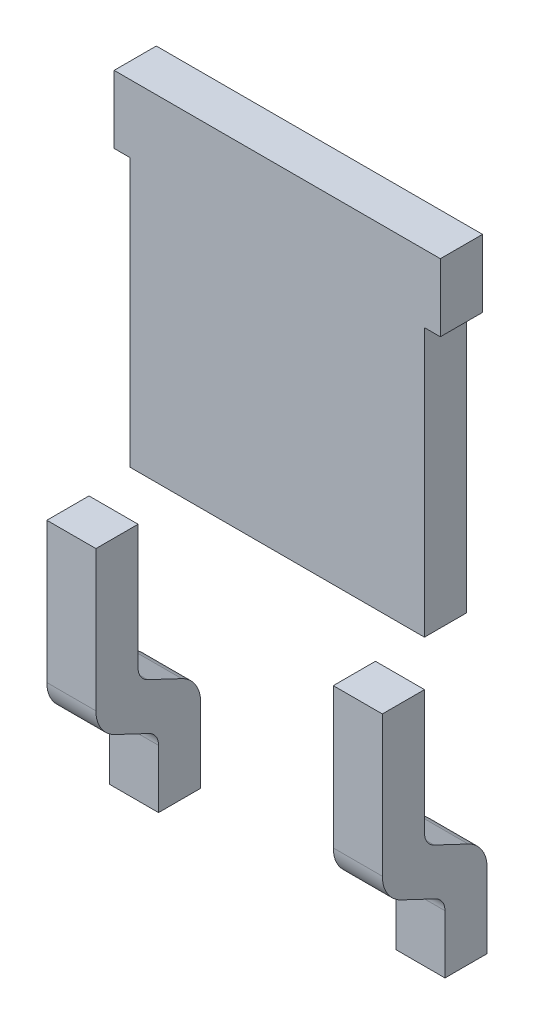
ISO-10303-21;
HEADER;
FILE_DESCRIPTION(('STEP AP214'),'2;1');
FILE_NAME('part.step','',(''),(''),'','','');
FILE_SCHEMA(('AUTOMOTIVE_DESIGN { 1 0 10303 214 1 1 1 1 }'));
ENDSEC;
DATA;
#1=APPLICATION_CONTEXT('core data for automotive mechanical design processes');
#2=APPLICATION_PROTOCOL_DEFINITION('international standard','automotive_design',2000,#1);
#3=PRODUCT_CONTEXT('',#1,'mechanical');
#4=PRODUCT('Part','Part','',(#3));
#5=PRODUCT_RELATED_PRODUCT_CATEGORY('part','',(#4));
#6=PRODUCT_DEFINITION_FORMATION('','',#4);
#7=PRODUCT_DEFINITION_CONTEXT('part definition',#1,'design');
#8=PRODUCT_DEFINITION('design','',#6,#7);
#9=PRODUCT_DEFINITION_SHAPE('','',#8);
#10=(LENGTH_UNIT() NAMED_UNIT(*) SI_UNIT(.MILLI.,.METRE.));
#11=(NAMED_UNIT(*) PLANE_ANGLE_UNIT() SI_UNIT($,.RADIAN.));
#12=(NAMED_UNIT(*) SI_UNIT($,.STERADIAN.) SOLID_ANGLE_UNIT());
#13=UNCERTAINTY_MEASURE_WITH_UNIT(LENGTH_MEASURE(1.E-05),#10,'distance_accuracy_value','');
#14=(GEOMETRIC_REPRESENTATION_CONTEXT(3) GLOBAL_UNCERTAINTY_ASSIGNED_CONTEXT((#13)) GLOBAL_UNIT_ASSIGNED_CONTEXT((#10,
#11,#12)) REPRESENTATION_CONTEXT('',''));
#15=CARTESIAN_POINT('',(0.,0.,0.));
#16=DIRECTION('',(0.,0.,1.));
#17=DIRECTION('',(1.,0.,0.));
#18=AXIS2_PLACEMENT_3D('',#15,#16,#17);
#19=CARTESIAN_POINT('',(0.,2.2733,0.));
#20=DIRECTION('',(0.,0.,1.));
#21=DIRECTION('',(1.,0.,0.));
#22=AXIS2_PLACEMENT_3D('',#19,#20,#21);
#23=PLANE('',#22);
#24=DIRECTION('',(1.,0.,0.));
#25=VECTOR('',#24,1.);
#26=CARTESIAN_POINT('',(0.,3.8735,0.));
#27=LINE('',#26,#25);
#28=CARTESIAN_POINT('',(-2.6035,3.8735,0.));
#29=VERTEX_POINT('',#28);
#30=CARTESIAN_POINT('',(-2.3495,3.8735,0.));
#31=VERTEX_POINT('',#30);
#32=EDGE_CURVE('P0_E87',#29,#31,#27,.T.);
#33=ORIENTED_EDGE('',*,*,#32,.F.);
#34=DIRECTION('',(0.,1.,0.));
#35=VECTOR('',#34,1.);
#36=CARTESIAN_POINT('',(-2.6035,2.2733,0.));
#37=LINE('',#36,#35);
#38=CARTESIAN_POINT('',(-2.6035,4.953,0.));
#39=VERTEX_POINT('',#38);
#40=EDGE_CURVE('P0_E20',#39,#29,#37,.F.);
#41=ORIENTED_EDGE('',*,*,#40,.F.);
#42=DIRECTION('',(1.,0.,0.));
#43=VECTOR('',#42,1.);
#44=CARTESIAN_POINT('',(2.6035,4.953,0.));
#45=LINE('',#44,#43);
#46=CARTESIAN_POINT('',(2.6035,4.953,0.));
#47=VERTEX_POINT('',#46);
#48=EDGE_CURVE('P0_E121',#47,#39,#45,.F.);
#49=ORIENTED_EDGE('',*,*,#48,.F.);
#50=DIRECTION('',(0.,1.,0.));
#51=VECTOR('',#50,1.);
#52=CARTESIAN_POINT('',(2.6035,3.8735,0.));
#53=LINE('',#52,#51);
#54=CARTESIAN_POINT('',(2.6035,3.8735,0.));
#55=VERTEX_POINT('',#54);
#56=EDGE_CURVE('P0_E115',#55,#47,#53,.T.);
#57=ORIENTED_EDGE('',*,*,#56,.F.);
#58=DIRECTION('',(1.,0.,0.));
#59=VECTOR('',#58,1.);
#60=CARTESIAN_POINT('',(2.3495,3.8735,0.));
#61=LINE('',#60,#59);
#62=CARTESIAN_POINT('',(2.3495,3.8735,0.));
#63=VERTEX_POINT('',#62);
#64=EDGE_CURVE('P0_E109',#63,#55,#61,.T.);
#65=ORIENTED_EDGE('',*,*,#64,.F.);
#66=DIRECTION('',(0.,1.,0.));
#67=VECTOR('',#66,1.);
#68=CARTESIAN_POINT('',(2.3495,-0.4064,0.));
#69=LINE('',#68,#67);
#70=CARTESIAN_POINT('',(2.3495,-0.4064,0.));
#71=VERTEX_POINT('',#70);
#72=EDGE_CURVE('P0_E103',#71,#63,#69,.T.);
#73=ORIENTED_EDGE('',*,*,#72,.F.);
#74=DIRECTION('',(1.,0.,0.));
#75=VECTOR('',#74,1.);
#76=CARTESIAN_POINT('',(-2.3495,-0.4064,0.));
#77=LINE('',#76,#75);
#78=CARTESIAN_POINT('',(-2.3495,-0.4064,0.));
#79=VERTEX_POINT('',#78);
#80=EDGE_CURVE('P0_E80',#79,#71,#77,.T.);
#81=ORIENTED_EDGE('',*,*,#80,.F.);
#82=DIRECTION('',(0.,1.,0.));
#83=VECTOR('',#82,1.);
#84=CARTESIAN_POINT('',(-2.3495,3.8735,0.));
#85=LINE('',#84,#83);
#86=EDGE_CURVE('P0_E95',#31,#79,#85,.F.);
#87=ORIENTED_EDGE('',*,*,#86,.F.);
#88=EDGE_LOOP('',(#33,#41,#49,#57,#65,#73,#81,#87));
#89=FACE_BOUND('',#88,.T.);
#90=ADVANCED_FACE('P0_F17',(#89),#23,.F.);
#91=CARTESIAN_POINT('',(-2.3495,3.8735,0.));
#92=DIRECTION('',(-1.,0.,0.));
#93=DIRECTION('',(0.,0.,1.));
#94=AXIS2_PLACEMENT_3D('',#91,#92,#93);
#95=PLANE('',#94);
#96=DIRECTION('',(0.,1.,0.));
#97=VECTOR('',#96,1.);
#98=CARTESIAN_POINT('',(-2.3495,2.2733,0.6731));
#99=LINE('',#98,#97);
#100=CARTESIAN_POINT('',(-2.3495,3.8735,0.6731));
#101=VERTEX_POINT('',#100);
#102=CARTESIAN_POINT('',(-2.3495,-0.4064,0.6731));
#103=VERTEX_POINT('',#102);
#104=EDGE_CURVE('P0_E92',#101,#103,#99,.F.);
#105=ORIENTED_EDGE('',*,*,#104,.F.);
#106=DIRECTION('',(0.,0.,1.));
#107=VECTOR('',#106,1.);
#108=CARTESIAN_POINT('',(-2.3495,3.8735,0.));
#109=LINE('',#108,#107);
#110=EDGE_CURVE('P0_E93',#31,#101,#109,.T.);
#111=ORIENTED_EDGE('',*,*,#110,.F.);
#112=ORIENTED_EDGE('',*,*,#86,.T.);
#113=DIRECTION('',(0.,0.,-1.));
#114=VECTOR('',#113,1.);
#115=CARTESIAN_POINT('',(-2.3495,-0.4064,0.));
#116=LINE('',#115,#114);
#117=EDGE_CURVE('P0_E100',#103,#79,#116,.T.);
#118=ORIENTED_EDGE('',*,*,#117,.F.);
#119=EDGE_LOOP('',(#105,#111,#112,#118));
#120=FACE_BOUND('',#119,.T.);
#121=ADVANCED_FACE('P0_F163',(#120),#95,.T.);
#122=CARTESIAN_POINT('',(-2.3495,-0.4064,0.));
#123=DIRECTION('',(0.,-1.,0.));
#124=DIRECTION('',(0.,0.,-1.));
#125=AXIS2_PLACEMENT_3D('',#122,#123,#124);
#126=PLANE('',#125);
#127=DIRECTION('',(1.,0.,0.));
#128=VECTOR('',#127,1.);
#129=CARTESIAN_POINT('',(0.,-0.4064,0.6731));
#130=LINE('',#129,#128);
#131=CARTESIAN_POINT('',(2.3495,-0.4064,0.6731));
#132=VERTEX_POINT('',#131);
#133=EDGE_CURVE('P0_E130',#103,#132,#130,.T.);
#134=ORIENTED_EDGE('',*,*,#133,.F.);
#135=ORIENTED_EDGE('',*,*,#117,.T.);
#136=ORIENTED_EDGE('',*,*,#80,.T.);
#137=DIRECTION('',(0.,0.,-1.));
#138=VECTOR('',#137,1.);
#139=CARTESIAN_POINT('',(2.3495,-0.4064,0.));
#140=LINE('',#139,#138);
#141=EDGE_CURVE('P0_E106',#132,#71,#140,.T.);
#142=ORIENTED_EDGE('',*,*,#141,.F.);
#143=EDGE_LOOP('',(#134,#135,#136,#142));
#144=FACE_BOUND('',#143,.T.);
#145=ADVANCED_FACE('P0_F161',(#144),#126,.T.);
#146=CARTESIAN_POINT('',(2.3495,-0.4064,0.));
#147=DIRECTION('',(1.,0.,0.));
#148=DIRECTION('',(0.,0.,-1.));
#149=AXIS2_PLACEMENT_3D('',#146,#147,#148);
#150=PLANE('',#149);
#151=DIRECTION('',(0.,1.,0.));
#152=VECTOR('',#151,1.);
#153=CARTESIAN_POINT('',(2.3495,2.2733,0.6731));
#154=LINE('',#153,#152);
#155=CARTESIAN_POINT('',(2.3495,3.8735,0.6731));
#156=VERTEX_POINT('',#155);
#157=EDGE_CURVE('P0_E133',#132,#156,#154,.T.);
#158=ORIENTED_EDGE('',*,*,#157,.F.);
#159=ORIENTED_EDGE('',*,*,#141,.T.);
#160=ORIENTED_EDGE('',*,*,#72,.T.);
#161=DIRECTION('',(0.,0.,1.));
#162=VECTOR('',#161,1.);
#163=CARTESIAN_POINT('',(2.3495,3.8735,0.));
#164=LINE('',#163,#162);
#165=EDGE_CURVE('P0_E112',#156,#63,#164,.F.);
#166=ORIENTED_EDGE('',*,*,#165,.F.);
#167=EDGE_LOOP('',(#158,#159,#160,#166));
#168=FACE_BOUND('',#167,.T.);
#169=ADVANCED_FACE('P0_F158',(#168),#150,.T.);
#170=CARTESIAN_POINT('',(2.3495,3.8735,0.));
#171=DIRECTION('',(0.,-1.,0.));
#172=DIRECTION('',(1.,0.,0.));
#173=AXIS2_PLACEMENT_3D('',#170,#171,#172);
#174=PLANE('',#173);
#175=DIRECTION('',(1.,0.,0.));
#176=VECTOR('',#175,1.);
#177=CARTESIAN_POINT('',(0.,3.8735,0.6731));
#178=LINE('',#177,#176);
#179=CARTESIAN_POINT('',(2.6035,3.8735,0.6731));
#180=VERTEX_POINT('',#179);
#181=EDGE_CURVE('P0_E136',#156,#180,#178,.T.);
#182=ORIENTED_EDGE('',*,*,#181,.F.);
#183=ORIENTED_EDGE('',*,*,#165,.T.);
#184=ORIENTED_EDGE('',*,*,#64,.T.);
#185=DIRECTION('',(0.,0.,-1.));
#186=VECTOR('',#185,1.);
#187=CARTESIAN_POINT('',(2.6035,3.8735,0.));
#188=LINE('',#187,#186);
#189=EDGE_CURVE('P0_E118',#180,#55,#188,.T.);
#190=ORIENTED_EDGE('',*,*,#189,.F.);
#191=EDGE_LOOP('',(#182,#183,#184,#190));
#192=FACE_BOUND('',#191,.T.);
#193=ADVANCED_FACE('P0_F155',(#192),#174,.T.);
#194=CARTESIAN_POINT('',(2.6035,3.8735,0.));
#195=DIRECTION('',(1.,0.,0.));
#196=DIRECTION('',(0.,0.,-1.));
#197=AXIS2_PLACEMENT_3D('',#194,#195,#196);
#198=PLANE('',#197);
#199=DIRECTION('',(0.,1.,0.));
#200=VECTOR('',#199,1.);
#201=CARTESIAN_POINT('',(2.6035,2.2733,0.6731));
#202=LINE('',#201,#200);
#203=CARTESIAN_POINT('',(2.6035,4.953,0.6731));
#204=VERTEX_POINT('',#203);
#205=EDGE_CURVE('P0_E139',#180,#204,#202,.T.);
#206=ORIENTED_EDGE('',*,*,#205,.F.);
#207=ORIENTED_EDGE('',*,*,#189,.T.);
#208=ORIENTED_EDGE('',*,*,#56,.T.);
#209=DIRECTION('',(0.,0.,1.));
#210=VECTOR('',#209,1.);
#211=CARTESIAN_POINT('',(2.6035,4.953,0.));
#212=LINE('',#211,#210);
#213=EDGE_CURVE('P0_E123',#204,#47,#212,.F.);
#214=ORIENTED_EDGE('',*,*,#213,.F.);
#215=EDGE_LOOP('',(#206,#207,#208,#214));
#216=FACE_BOUND('',#215,.T.);
#217=ADVANCED_FACE('P0_F152',(#216),#198,.T.);
#218=CARTESIAN_POINT('',(2.6035,4.953,0.));
#219=DIRECTION('',(0.,1.,0.));
#220=DIRECTION('',(0.,0.,1.));
#221=AXIS2_PLACEMENT_3D('',#218,#219,#220);
#222=PLANE('',#221);
#223=DIRECTION('',(1.,0.,0.));
#224=VECTOR('',#223,1.);
#225=CARTESIAN_POINT('',(0.,4.953,0.6731));
#226=LINE('',#225,#224);
#227=CARTESIAN_POINT('',(-2.6035,4.953,0.6731));
#228=VERTEX_POINT('',#227);
#229=EDGE_CURVE('P0_E142',#204,#228,#226,.F.);
#230=ORIENTED_EDGE('',*,*,#229,.F.);
#231=ORIENTED_EDGE('',*,*,#213,.T.);
#232=ORIENTED_EDGE('',*,*,#48,.T.);
#233=DIRECTION('',(0.,0.,1.));
#234=VECTOR('',#233,1.);
#235=CARTESIAN_POINT('',(-2.6035,4.953,0.));
#236=LINE('',#235,#234);
#237=EDGE_CURVE('P0_E84',#228,#39,#236,.F.);
#238=ORIENTED_EDGE('',*,*,#237,.F.);
#239=EDGE_LOOP('',(#230,#231,#232,#238));
#240=FACE_BOUND('',#239,.T.);
#241=ADVANCED_FACE('P0_F150',(#240),#222,.T.);
#242=CARTESIAN_POINT('',(-2.6035,4.953,0.));
#243=DIRECTION('',(-1.,0.,0.));
#244=DIRECTION('',(0.,0.,1.));
#245=AXIS2_PLACEMENT_3D('',#242,#243,#244);
#246=PLANE('',#245);
#247=DIRECTION('',(0.,1.,0.));
#248=VECTOR('',#247,1.);
#249=CARTESIAN_POINT('',(-2.6035,2.2733,0.6731));
#250=LINE('',#249,#248);
#251=CARTESIAN_POINT('',(-2.6035,3.8735,0.6731));
#252=VERTEX_POINT('',#251);
#253=EDGE_CURVE('P0_E26',#228,#252,#250,.F.);
#254=ORIENTED_EDGE('',*,*,#253,.F.);
#255=ORIENTED_EDGE('',*,*,#237,.T.);
#256=ORIENTED_EDGE('',*,*,#40,.T.);
#257=DIRECTION('',(0.,0.,1.));
#258=VECTOR('',#257,1.);
#259=CARTESIAN_POINT('',(-2.6035,3.8735,0.));
#260=LINE('',#259,#258);
#261=EDGE_CURVE('P0_E35',#252,#29,#260,.F.);
#262=ORIENTED_EDGE('',*,*,#261,.F.);
#263=EDGE_LOOP('',(#254,#255,#256,#262));
#264=FACE_BOUND('',#263,.T.);
#265=ADVANCED_FACE('P0_F83',(#264),#246,.T.);
#266=CARTESIAN_POINT('',(-2.6035,3.8735,0.));
#267=DIRECTION('',(0.,-1.,0.));
#268=DIRECTION('',(1.,0.,0.));
#269=AXIS2_PLACEMENT_3D('',#266,#267,#268);
#270=PLANE('',#269);
#271=DIRECTION('',(1.,0.,0.));
#272=VECTOR('',#271,1.);
#273=CARTESIAN_POINT('',(0.,3.8735,0.6731));
#274=LINE('',#273,#272);
#275=EDGE_CURVE('P0_E11',#252,#101,#274,.T.);
#276=ORIENTED_EDGE('',*,*,#275,.F.);
#277=ORIENTED_EDGE('',*,*,#261,.T.);
#278=ORIENTED_EDGE('',*,*,#32,.T.);
#279=ORIENTED_EDGE('',*,*,#110,.T.);
#280=EDGE_LOOP('',(#276,#277,#278,#279));
#281=FACE_BOUND('',#280,.T.);
#282=ADVANCED_FACE('P0_F89',(#281),#270,.T.);
#283=CARTESIAN_POINT('',(0.,2.2733,0.6731));
#284=DIRECTION('',(0.,0.,1.));
#285=DIRECTION('',(1.,0.,0.));
#286=AXIS2_PLACEMENT_3D('',#283,#284,#285);
#287=PLANE('',#286);
#288=ORIENTED_EDGE('',*,*,#253,.T.);
#289=ORIENTED_EDGE('',*,*,#275,.T.);
#290=ORIENTED_EDGE('',*,*,#104,.T.);
#291=ORIENTED_EDGE('',*,*,#133,.T.);
#292=ORIENTED_EDGE('',*,*,#157,.T.);
#293=ORIENTED_EDGE('',*,*,#181,.T.);
#294=ORIENTED_EDGE('',*,*,#205,.T.);
#295=ORIENTED_EDGE('',*,*,#229,.T.);
#296=EDGE_LOOP('',(#288,#289,#290,#291,#292,#293,#294,#295));
#297=FACE_BOUND('',#296,.T.);
#298=ADVANCED_FACE('P0_F146',(#297),#287,.T.);
#299=CLOSED_SHELL('',(#90,#121,#145,#169,#193,#217,#241,#265,#282,#298));
#300=MANIFOLD_SOLID_BREP('P0_B1',#299);
#301=CARTESIAN_POINT('',(2.6775,-2.8779687738,0.83655));
#302=DIRECTION('',(1.,0.,0.));
#303=DIRECTION('',(0.,0.,-1.));
#304=AXIS2_PLACEMENT_3D('',#301,#302,#303);
#305=PLANE('',#304);
#306=DIRECTION('',(0.,0.,-1.));
#307=VECTOR('',#306,1.);
#308=CARTESIAN_POINT('',(2.6775,-4.953,0.6731));
#309=LINE('',#308,#307);
#310=CARTESIAN_POINT('',(2.6775,-4.953,0.));
#311=VERTEX_POINT('',#310);
#312=CARTESIAN_POINT('',(2.6775,-4.953,0.6731));
#313=VERTEX_POINT('',#312);
#314=EDGE_CURVE('P1_E134',#311,#313,#309,.F.);
#315=ORIENTED_EDGE('',*,*,#314,.F.);
#316=DIRECTION('',(0.,1.,0.));
#317=VECTOR('',#316,1.);
#318=CARTESIAN_POINT('',(2.6775,-4.953,0.));
#319=LINE('',#318,#317);
#320=CARTESIAN_POINT('',(2.6775,-3.764557886399,0.));
#321=VERTEX_POINT('',#320);
#322=EDGE_CURVE('P1_E140',#321,#311,#319,.F.);
#323=ORIENTED_EDGE('',*,*,#322,.F.);
#324=CARTESIAN_POINT('',(2.6775,-3.764557886399,0.53));
#325=DIRECTION('',(1.,0.,0.));
#326=DIRECTION('',(0.,0.,-1.));
#327=AXIS2_PLACEMENT_3D('',#324,#325,#326);
#328=CIRCLE('',#327,0.53);
#329=CARTESIAN_POINT('',(2.6775,-3.28548074768504,0.303317192621508));
#330=VERTEX_POINT('',#329);
#331=EDGE_CURVE('P1_E92',#330,#321,#328,.F.);
#332=ORIENTED_EDGE('',*,*,#331,.F.);
#333=DIRECTION('',(0.,0.427703410149376,0.903919129649658));
#334=VECTOR('',#333,1.);
#335=CARTESIAN_POINT('',(2.6775,-3.285480747685,0.303317192622));
#336=LINE('',#335,#334);
#337=CARTESIAN_POINT('',(2.6775,-3.02759405623112,0.848341403689312));
#338=VERTEX_POINT('',#337);
#339=EDGE_CURVE('P1_E93',#330,#338,#336,.T.);
#340=ORIENTED_EDGE('',*,*,#339,.T.);
#341=CARTESIAN_POINT('',(2.6775,-2.788055486874,0.735));
#342=DIRECTION('',(1.,0.,0.));
#343=DIRECTION('',(0.,0.,-1.));
#344=AXIS2_PLACEMENT_3D('',#341,#342,#343);
#345=CIRCLE('',#344,0.265);
#346=CARTESIAN_POINT('',(2.6775,-2.788055486874,1.));
#347=VERTEX_POINT('',#346);
#348=EDGE_CURVE('P1_E20',#338,#347,#345,.F.);
#349=ORIENTED_EDGE('',*,*,#348,.T.);
#350=DIRECTION('',(0.,1.,0.));
#351=VECTOR('',#350,1.);
#352=CARTESIAN_POINT('',(2.6775,-2.955834430074,1.));
#353=LINE('',#352,#351);
#354=CARTESIAN_POINT('',(2.6775,-0.802937547601,1.));
#355=VERTEX_POINT('',#354);
#356=EDGE_CURVE('P1_E172',#355,#347,#353,.F.);
#357=ORIENTED_EDGE('',*,*,#356,.F.);
#358=DIRECTION('',(0.,0.,1.));
#359=VECTOR('',#358,1.);
#360=CARTESIAN_POINT('',(2.6775,-0.802937547601,1.));
#361=LINE('',#360,#359);
#362=CARTESIAN_POINT('',(2.6775,-0.802937547600993,1.6731));
#363=VERTEX_POINT('',#362);
#364=EDGE_CURVE('P1_E109',#363,#355,#361,.F.);
#365=ORIENTED_EDGE('',*,*,#364,.F.);
#366=DIRECTION('',(0.,-1.,0.));
#367=VECTOR('',#366,1.);
#368=CARTESIAN_POINT('',(2.6775,-0.802937547601,1.6731));
#369=LINE('',#368,#367);
#370=CARTESIAN_POINT('',(2.6775,-3.046435059402,1.6731));
#371=VERTEX_POINT('',#370);
#372=EDGE_CURVE('P1_E116',#371,#363,#369,.F.);
#373=ORIENTED_EDGE('',*,*,#372,.F.);
#374=CARTESIAN_POINT('',(2.6775,-3.046435059402,1.1431));
#375=DIRECTION('',(1.,0.,0.));
#376=DIRECTION('',(0.,0.,-1.));
#377=AXIS2_PLACEMENT_3D('',#374,#375,#376);
#378=CIRCLE('',#377,0.53);
#379=CARTESIAN_POINT('',(2.6775,-3.52551219811648,1.36978280737833));
#380=VERTEX_POINT('',#379);
#381=EDGE_CURVE('P1_E125',#380,#371,#378,.F.);
#382=ORIENTED_EDGE('',*,*,#381,.F.);
#383=DIRECTION('',(0.,-0.427703410148119,-0.903919129650252));
#384=VECTOR('',#383,1.);
#385=CARTESIAN_POINT('',(2.6775,-3.381992945801,1.6731));
#386=LINE('',#385,#384);
#387=CARTESIAN_POINT('',(2.6775,-3.78339888956958,0.824758596310751));
#388=VERTEX_POINT('',#387);
#389=EDGE_CURVE('P1_E122',#388,#380,#386,.F.);
#390=ORIENTED_EDGE('',*,*,#389,.F.);
#391=CARTESIAN_POINT('',(2.6775,-4.022937458927,0.9381));
#392=DIRECTION('',(1.,0.,0.));
#393=DIRECTION('',(0.,0.,-1.));
#394=AXIS2_PLACEMENT_3D('',#391,#392,#393);
#395=CIRCLE('',#394,0.265);
#396=CARTESIAN_POINT('',(2.6775,-4.022937458927,0.6731));
#397=VERTEX_POINT('',#396);
#398=EDGE_CURVE('P1_E130',#388,#397,#395,.F.);
#399=ORIENTED_EDGE('',*,*,#398,.T.);
#400=DIRECTION('',(0.,1.,0.));
#401=VECTOR('',#400,1.);
#402=CARTESIAN_POINT('',(2.6775,-3.855158515727,0.6731));
#403=LINE('',#402,#401);
#404=EDGE_CURVE('P1_E127',#313,#397,#403,.T.);
#405=ORIENTED_EDGE('',*,*,#404,.F.);
#406=EDGE_LOOP('',(#315,#323,#332,#340,#349,#357,#365,#373,#382,#390,#399,#405));
#407=FACE_BOUND('',#406,.T.);
#408=ADVANCED_FACE('P1_F17',(#407),#305,.T.);
#409=CARTESIAN_POINT('',(2.286,-3.764557886399,0.53));
#410=DIRECTION('',(1.,0.,0.));
#411=DIRECTION('',(0.,0.,-1.));
#412=AXIS2_PLACEMENT_3D('',#409,#410,#411);
#413=CYLINDRICAL_SURFACE('',#412,0.53);
#414=CARTESIAN_POINT('',(1.8945,-3.764557886399,0.53));
#415=DIRECTION('',(1.,0.,0.));
#416=DIRECTION('',(0.,0.,-1.));
#417=AXIS2_PLACEMENT_3D('',#414,#415,#416);
#418=CIRCLE('',#417,0.53);
#419=CARTESIAN_POINT('',(1.8945,-3.28548074768504,0.303317192621508));
#420=VERTEX_POINT('',#419);
#421=CARTESIAN_POINT('',(1.8945,-3.764557886399,0.));
#422=VERTEX_POINT('',#421);
#423=EDGE_CURVE('P1_E157',#420,#422,#418,.F.);
#424=ORIENTED_EDGE('',*,*,#423,.F.);
#425=DIRECTION('',(1.,0.,0.));
#426=VECTOR('',#425,1.);
#427=CARTESIAN_POINT('',(2.286,-3.28548074768468,0.303317192621849));
#428=LINE('',#427,#426);
#429=EDGE_CURVE('P1_E99',#330,#420,#428,.F.);
#430=ORIENTED_EDGE('',*,*,#429,.F.);
#431=ORIENTED_EDGE('',*,*,#331,.T.);
#432=DIRECTION('',(-1.,0.,0.));
#433=VECTOR('',#432,1.);
#434=CARTESIAN_POINT('',(2.286,-3.764557886399,0.));
#435=LINE('',#434,#433);
#436=EDGE_CURVE('P1_E143',#422,#321,#435,.F.);
#437=ORIENTED_EDGE('',*,*,#436,.F.);
#438=EDGE_LOOP('',(#424,#430,#431,#437));
#439=FACE_BOUND('',#438,.T.);
#440=ADVANCED_FACE('P1_F252',(#439),#413,.T.);
#441=CARTESIAN_POINT('',(2.286,-4.953,0.));
#442=DIRECTION('',(0.,0.,-1.));
#443=DIRECTION('',(-1.,0.,0.));
#444=AXIS2_PLACEMENT_3D('',#441,#442,#443);
#445=PLANE('',#444);
#446=DIRECTION('',(1.,0.,0.));
#447=VECTOR('',#446,1.);
#448=CARTESIAN_POINT('',(2.286,-4.953,0.));
#449=LINE('',#448,#447);
#450=CARTESIAN_POINT('',(1.8945,-4.953,0.));
#451=VERTEX_POINT('',#450);
#452=EDGE_CURVE('P1_E137',#451,#311,#449,.T.);
#453=ORIENTED_EDGE('',*,*,#452,.F.);
#454=DIRECTION('',(0.,1.,0.));
#455=VECTOR('',#454,1.);
#456=CARTESIAN_POINT('',(1.8945,-2.8779687738,0.));
#457=LINE('',#456,#455);
#458=EDGE_CURVE('P1_E160',#422,#451,#457,.F.);
#459=ORIENTED_EDGE('',*,*,#458,.F.);
#460=ORIENTED_EDGE('',*,*,#436,.T.);
#461=ORIENTED_EDGE('',*,*,#322,.T.);
#462=EDGE_LOOP('',(#453,#459,#460,#461));
#463=FACE_BOUND('',#462,.T.);
#464=ADVANCED_FACE('P1_F216',(#463),#445,.T.);
#465=CARTESIAN_POINT('',(2.286,-4.953,0.6731));
#466=DIRECTION('',(0.,-1.,0.));
#467=DIRECTION('',(0.,0.,-1.));
#468=AXIS2_PLACEMENT_3D('',#465,#466,#467);
#469=PLANE('',#468);
#470=DIRECTION('',(1.,0.,0.));
#471=VECTOR('',#470,1.);
#472=CARTESIAN_POINT('',(2.286,-4.953,0.6731));
#473=LINE('',#472,#471);
#474=CARTESIAN_POINT('',(1.8945,-4.953,0.6731));
#475=VERTEX_POINT('',#474);
#476=EDGE_CURVE('P1_E131',#475,#313,#473,.T.);
#477=ORIENTED_EDGE('',*,*,#476,.F.);
#478=DIRECTION('',(0.,0.,1.));
#479=VECTOR('',#478,1.);
#480=CARTESIAN_POINT('',(1.8945,-4.953,0.83655));
#481=LINE('',#480,#479);
#482=EDGE_CURVE('P1_E204',#451,#475,#481,.T.);
#483=ORIENTED_EDGE('',*,*,#482,.F.);
#484=ORIENTED_EDGE('',*,*,#452,.T.);
#485=ORIENTED_EDGE('',*,*,#314,.T.);
#486=EDGE_LOOP('',(#477,#483,#484,#485));
#487=FACE_BOUND('',#486,.T.);
#488=ADVANCED_FACE('P1_F213',(#487),#469,.T.);
#489=CARTESIAN_POINT('',(2.286,-3.855158515727,0.6731));
#490=DIRECTION('',(0.,0.,1.));
#491=DIRECTION('',(1.,0.,0.));
#492=AXIS2_PLACEMENT_3D('',#489,#490,#491);
#493=PLANE('',#492);
#494=ORIENTED_EDGE('',*,*,#476,.T.);
#495=ORIENTED_EDGE('',*,*,#404,.T.);
#496=DIRECTION('',(1.,0.,0.));
#497=VECTOR('',#496,1.);
#498=CARTESIAN_POINT('',(2.286,-4.022937458927,0.6731));
#499=LINE('',#498,#497);
#500=CARTESIAN_POINT('',(1.8945,-4.022937458927,0.6731));
#501=VERTEX_POINT('',#500);
#502=EDGE_CURVE('P1_E163',#397,#501,#499,.F.);
#503=ORIENTED_EDGE('',*,*,#502,.T.);
#504=DIRECTION('',(0.,1.,0.));
#505=VECTOR('',#504,1.);
#506=CARTESIAN_POINT('',(1.8945,-2.8779687738,0.6731));
#507=LINE('',#506,#505);
#508=EDGE_CURVE('P1_E156',#475,#501,#507,.T.);
#509=ORIENTED_EDGE('',*,*,#508,.F.);
#510=EDGE_LOOP('',(#494,#495,#503,#509));
#511=FACE_BOUND('',#510,.T.);
#512=ADVANCED_FACE('P1_F287',(#511),#493,.T.);
#513=CARTESIAN_POINT('',(2.286,-4.022937458927,0.9381));
#514=DIRECTION('',(1.,0.,0.));
#515=DIRECTION('',(0.,0.,-1.));
#516=AXIS2_PLACEMENT_3D('',#513,#514,#515);
#517=CYLINDRICAL_SURFACE('',#516,0.265);
#518=ORIENTED_EDGE('',*,*,#502,.F.);
#519=ORIENTED_EDGE('',*,*,#398,.F.);
#520=DIRECTION('',(1.,0.,0.));
#521=VECTOR('',#520,1.);
#522=CARTESIAN_POINT('',(2.286,-3.78339888956956,0.824758596310793));
#523=LINE('',#522,#521);
#524=CARTESIAN_POINT('',(1.8945,-3.78339888956988,0.824758596310688));
#525=VERTEX_POINT('',#524);
#526=EDGE_CURVE('P1_E126',#525,#388,#523,.T.);
#527=ORIENTED_EDGE('',*,*,#526,.F.);
#528=CARTESIAN_POINT('',(1.8945,-4.022937458927,0.9381));
#529=DIRECTION('',(1.,0.,0.));
#530=DIRECTION('',(0.,0.,-1.));
#531=AXIS2_PLACEMENT_3D('',#528,#529,#530);
#532=CIRCLE('',#531,0.265);
#533=EDGE_CURVE('P1_E153',#501,#525,#532,.T.);
#534=ORIENTED_EDGE('',*,*,#533,.F.);
#535=EDGE_LOOP('',(#518,#519,#527,#534));
#536=FACE_BOUND('',#535,.T.);
#537=ADVANCED_FACE('P1_F283',(#536),#517,.F.);
#538=CARTESIAN_POINT('',(2.286,-3.381992945801,1.6731));
#539=DIRECTION('',(0.,-0.903919129650252,0.427703410148119));
#540=DIRECTION('',(0.,-0.427703410148119,-0.903919129650252));
#541=AXIS2_PLACEMENT_3D('',#538,#539,#540);
#542=PLANE('',#541);
#543=DIRECTION('',(1.,0.,0.));
#544=VECTOR('',#543,1.);
#545=CARTESIAN_POINT('',(2.286,-3.52551219811671,1.36978280737834));
#546=LINE('',#545,#544);
#547=CARTESIAN_POINT('',(1.8945,-3.52551219811616,1.36978280737858));
#548=VERTEX_POINT('',#547);
#549=EDGE_CURVE('P1_E162',#548,#380,#546,.T.);
#550=ORIENTED_EDGE('',*,*,#549,.F.);
#551=DIRECTION('',(0.,0.427703410149377,0.903919129649657));
#552=VECTOR('',#551,1.);
#553=CARTESIAN_POINT('',(1.8945,-3.78339888957,0.824758596311));
#554=LINE('',#553,#552);
#555=EDGE_CURVE('P1_E152',#525,#548,#554,.T.);
#556=ORIENTED_EDGE('',*,*,#555,.F.);
#557=ORIENTED_EDGE('',*,*,#526,.T.);
#558=ORIENTED_EDGE('',*,*,#389,.T.);
#559=EDGE_LOOP('',(#550,#556,#557,#558));
#560=FACE_BOUND('',#559,.T.);
#561=ADVANCED_FACE('P1_F279',(#560),#542,.T.);
#562=CARTESIAN_POINT('',(2.286,-3.046435059402,1.1431));
#563=DIRECTION('',(1.,0.,0.));
#564=DIRECTION('',(0.,0.,-1.));
#565=AXIS2_PLACEMENT_3D('',#562,#563,#564);
#566=CYLINDRICAL_SURFACE('',#565,0.53);
#567=CARTESIAN_POINT('',(1.8945,-3.046435059402,1.1431));
#568=DIRECTION('',(1.,0.,0.));
#569=DIRECTION('',(0.,0.,-1.));
#570=AXIS2_PLACEMENT_3D('',#567,#568,#569);
#571=CIRCLE('',#570,0.53);
#572=CARTESIAN_POINT('',(1.8945,-3.046435059402,1.6731));
#573=VERTEX_POINT('',#572);
#574=EDGE_CURVE('P1_E148',#548,#573,#571,.F.);
#575=ORIENTED_EDGE('',*,*,#574,.F.);
#576=ORIENTED_EDGE('',*,*,#549,.T.);
#577=ORIENTED_EDGE('',*,*,#381,.T.);
#578=DIRECTION('',(1.,0.,0.));
#579=VECTOR('',#578,1.);
#580=CARTESIAN_POINT('',(2.286,-3.046435059402,1.6731));
#581=LINE('',#580,#579);
#582=EDGE_CURVE('P1_E119',#573,#371,#581,.T.);
#583=ORIENTED_EDGE('',*,*,#582,.F.);
#584=EDGE_LOOP('',(#575,#576,#577,#583));
#585=FACE_BOUND('',#584,.T.);
#586=ADVANCED_FACE('P1_F276',(#585),#566,.T.);
#587=CARTESIAN_POINT('',(2.286,-0.802937547601,1.6731));
#588=DIRECTION('',(0.,0.,1.));
#589=DIRECTION('',(0.,-1.,0.));
#590=AXIS2_PLACEMENT_3D('',#587,#588,#589);
#591=PLANE('',#590);
#592=DIRECTION('',(1.,0.,0.));
#593=VECTOR('',#592,1.);
#594=CARTESIAN_POINT('',(2.286,-0.802937547600989,1.6731));
#595=LINE('',#594,#593);
#596=CARTESIAN_POINT('',(1.8945,-0.802937547600996,1.6731));
#597=VERTEX_POINT('',#596);
#598=EDGE_CURVE('P1_E113',#597,#363,#595,.T.);
#599=ORIENTED_EDGE('',*,*,#598,.F.);
#600=DIRECTION('',(0.,1.,0.));
#601=VECTOR('',#600,1.);
#602=CARTESIAN_POINT('',(1.8945,-2.8779687738,1.6731));
#603=LINE('',#602,#601);
#604=EDGE_CURVE('P1_E151',#573,#597,#603,.T.);
#605=ORIENTED_EDGE('',*,*,#604,.F.);
#606=ORIENTED_EDGE('',*,*,#582,.T.);
#607=ORIENTED_EDGE('',*,*,#372,.T.);
#608=EDGE_LOOP('',(#599,#605,#606,#607));
#609=FACE_BOUND('',#608,.T.);
#610=ADVANCED_FACE('P1_F273',(#609),#591,.T.);
#611=CARTESIAN_POINT('',(2.286,-0.802937547601,1.));
#612=DIRECTION('',(0.,1.,0.));
#613=DIRECTION('',(0.,0.,1.));
#614=AXIS2_PLACEMENT_3D('',#611,#612,#613);
#615=PLANE('',#614);
#616=DIRECTION('',(-1.,0.,0.));
#617=VECTOR('',#616,1.);
#618=CARTESIAN_POINT('',(2.286,-0.802937547601,1.));
#619=LINE('',#618,#617);
#620=CARTESIAN_POINT('',(1.8945,-0.802937547601,1.));
#621=VERTEX_POINT('',#620);
#622=EDGE_CURVE('P1_E112',#621,#355,#619,.F.);
#623=ORIENTED_EDGE('',*,*,#622,.F.);
#624=DIRECTION('',(0.,0.,1.));
#625=VECTOR('',#624,1.);
#626=CARTESIAN_POINT('',(1.8945,-0.802937547601,0.83655));
#627=LINE('',#626,#625);
#628=EDGE_CURVE('P1_E184',#597,#621,#627,.F.);
#629=ORIENTED_EDGE('',*,*,#628,.F.);
#630=ORIENTED_EDGE('',*,*,#598,.T.);
#631=ORIENTED_EDGE('',*,*,#364,.T.);
#632=EDGE_LOOP('',(#623,#629,#630,#631));
#633=FACE_BOUND('',#632,.T.);
#634=ADVANCED_FACE('P1_F227',(#633),#615,.T.);
#635=CARTESIAN_POINT('',(2.286,-2.955834430074,1.));
#636=DIRECTION('',(0.,0.,-1.));
#637=DIRECTION('',(-1.,0.,0.));
#638=AXIS2_PLACEMENT_3D('',#635,#636,#637);
#639=PLANE('',#638);
#640=ORIENTED_EDGE('',*,*,#622,.T.);
#641=ORIENTED_EDGE('',*,*,#356,.T.);
#642=DIRECTION('',(1.,0.,0.));
#643=VECTOR('',#642,1.);
#644=CARTESIAN_POINT('',(2.286,-2.788055486874,1.));
#645=LINE('',#644,#643);
#646=CARTESIAN_POINT('',(1.8945,-2.788055486874,1.));
#647=VERTEX_POINT('',#646);
#648=EDGE_CURVE('P1_E87',#347,#647,#645,.F.);
#649=ORIENTED_EDGE('',*,*,#648,.T.);
#650=DIRECTION('',(0.,1.,0.));
#651=VECTOR('',#650,1.);
#652=CARTESIAN_POINT('',(1.8945,-2.8779687738,1.));
#653=LINE('',#652,#651);
#654=EDGE_CURVE('P1_E147',#621,#647,#653,.F.);
#655=ORIENTED_EDGE('',*,*,#654,.F.);
#656=EDGE_LOOP('',(#640,#641,#649,#655));
#657=FACE_BOUND('',#656,.T.);
#658=ADVANCED_FACE('P1_F231',(#657),#639,.T.);
#659=CARTESIAN_POINT('',(2.286,-2.788055486874,0.735));
#660=DIRECTION('',(1.,0.,0.));
#661=DIRECTION('',(0.,0.,-1.));
#662=AXIS2_PLACEMENT_3D('',#659,#660,#661);
#663=CYLINDRICAL_SURFACE('',#662,0.265);
#664=ORIENTED_EDGE('',*,*,#648,.F.);
#665=ORIENTED_EDGE('',*,*,#348,.F.);
#666=DIRECTION('',(1.,0.,0.));
#667=VECTOR('',#666,1.);
#668=CARTESIAN_POINT('',(2.286,-3.02759405623144,0.848341403689207));
#669=LINE('',#668,#667);
#670=CARTESIAN_POINT('',(1.8945,-3.02759405623112,0.848341403689312));
#671=VERTEX_POINT('',#670);
#672=EDGE_CURVE('P1_E35',#671,#338,#669,.T.);
#673=ORIENTED_EDGE('',*,*,#672,.F.);
#674=CARTESIAN_POINT('',(1.8945,-2.788055486874,0.735));
#675=DIRECTION('',(1.,0.,0.));
#676=DIRECTION('',(0.,0.,-1.));
#677=AXIS2_PLACEMENT_3D('',#674,#675,#676);
#678=CIRCLE('',#677,0.265);
#679=EDGE_CURVE('P1_E26',#647,#671,#678,.T.);
#680=ORIENTED_EDGE('',*,*,#679,.F.);
#681=EDGE_LOOP('',(#664,#665,#673,#680));
#682=FACE_BOUND('',#681,.T.);
#683=ADVANCED_FACE('P1_F86',(#682),#663,.F.);
#684=CARTESIAN_POINT('',(2.286,-3.429,0.));
#685=DIRECTION('',(0.,0.903919129650252,-0.427703410148119));
#686=DIRECTION('',(0.,0.427703410148119,0.903919129650252));
#687=AXIS2_PLACEMENT_3D('',#684,#685,#686);
#688=PLANE('',#687);
#689=ORIENTED_EDGE('',*,*,#429,.T.);
#690=DIRECTION('',(0.,-0.427703410149376,-0.903919129649658));
#691=VECTOR('',#690,1.);
#692=CARTESIAN_POINT('',(1.8945,-3.027594056231,0.848341403689));
#693=LINE('',#692,#691);
#694=EDGE_CURVE('P1_E11',#671,#420,#693,.T.);
#695=ORIENTED_EDGE('',*,*,#694,.F.);
#696=ORIENTED_EDGE('',*,*,#672,.T.);
#697=ORIENTED_EDGE('',*,*,#339,.F.);
#698=EDGE_LOOP('',(#689,#695,#696,#697));
#699=FACE_BOUND('',#698,.T.);
#700=ADVANCED_FACE('P1_F96',(#699),#688,.T.);
#701=CARTESIAN_POINT('',(1.8945,-2.8779687738,0.83655));
#702=DIRECTION('',(-1.,0.,0.));
#703=DIRECTION('',(0.,0.,1.));
#704=AXIS2_PLACEMENT_3D('',#701,#702,#703);
#705=PLANE('',#704);
#706=ORIENTED_EDGE('',*,*,#679,.T.);
#707=ORIENTED_EDGE('',*,*,#694,.T.);
#708=ORIENTED_EDGE('',*,*,#423,.T.);
#709=ORIENTED_EDGE('',*,*,#458,.T.);
#710=ORIENTED_EDGE('',*,*,#482,.T.);
#711=ORIENTED_EDGE('',*,*,#508,.T.);
#712=ORIENTED_EDGE('',*,*,#533,.T.);
#713=ORIENTED_EDGE('',*,*,#555,.T.);
#714=ORIENTED_EDGE('',*,*,#574,.T.);
#715=ORIENTED_EDGE('',*,*,#604,.T.);
#716=ORIENTED_EDGE('',*,*,#628,.T.);
#717=ORIENTED_EDGE('',*,*,#654,.T.);
#718=EDGE_LOOP('',(#706,#707,#708,#709,#710,#711,#712,#713,#714,#715,#716,#717));
#719=FACE_BOUND('',#718,.T.);
#720=ADVANCED_FACE('P1_F234',(#719),#705,.T.);
#721=CLOSED_SHELL('',(#408,#440,#464,#488,#512,#537,#561,#586,#610,#634,#658,#683,#700,#720));
#722=MANIFOLD_SOLID_BREP('P1_B1',#721);
#723=CARTESIAN_POINT('',(-2.6775,-2.8779687738,0.83655));
#724=DIRECTION('',(1.,0.,0.));
#725=DIRECTION('',(0.,0.,-1.));
#726=AXIS2_PLACEMENT_3D('',#723,#724,#725);
#727=PLANE('',#726);
#728=DIRECTION('',(0.,1.,0.));
#729=VECTOR('',#728,1.);
#730=CARTESIAN_POINT('',(-2.6775,-4.953,0.));
#731=LINE('',#730,#729);
#732=CARTESIAN_POINT('',(-2.6775,-3.764557886399,0.));
#733=VERTEX_POINT('',#732);
#734=CARTESIAN_POINT('',(-2.6775,-4.953,0.));
#735=VERTEX_POINT('',#734);
#736=EDGE_CURVE('P2_E181',#733,#735,#731,.F.);
#737=ORIENTED_EDGE('',*,*,#736,.T.);
#738=DIRECTION('',(0.,0.,1.));
#739=VECTOR('',#738,1.);
#740=CARTESIAN_POINT('',(-2.6775,-4.953,0.6731));
#741=LINE('',#740,#739);
#742=CARTESIAN_POINT('',(-2.6775,-4.953,0.6731));
#743=VERTEX_POINT('',#742);
#744=EDGE_CURVE('P2_E94',#735,#743,#741,.T.);
#745=ORIENTED_EDGE('',*,*,#744,.T.);
#746=DIRECTION('',(0.,1.,0.));
#747=VECTOR('',#746,1.);
#748=CARTESIAN_POINT('',(-2.6775,-3.855158515727,0.6731));
#749=LINE('',#748,#747);
#750=CARTESIAN_POINT('',(-2.6775,-4.022937458927,0.6731));
#751=VERTEX_POINT('',#750);
#752=EDGE_CURVE('P2_E164',#743,#751,#749,.T.);
#753=ORIENTED_EDGE('',*,*,#752,.T.);
#754=CARTESIAN_POINT('',(-2.6775,-4.022937458927,0.9381));
#755=DIRECTION('',(1.,0.,0.));
#756=DIRECTION('',(0.,0.,-1.));
#757=AXIS2_PLACEMENT_3D('',#754,#755,#756);
#758=CIRCLE('',#757,0.265);
#759=CARTESIAN_POINT('',(-2.6775,-3.78339888956958,0.824758596310751));
#760=VERTEX_POINT('',#759);
#761=EDGE_CURVE('P2_E163',#751,#760,#758,.T.);
#762=ORIENTED_EDGE('',*,*,#761,.T.);
#763=DIRECTION('',(0.,0.427703410148119,0.903919129650252));
#764=VECTOR('',#763,1.);
#765=CARTESIAN_POINT('',(-2.6775,-3.381992945801,1.6731));
#766=LINE('',#765,#764);
#767=CARTESIAN_POINT('',(-2.6775,-3.52551219811648,1.36978280737833));
#768=VERTEX_POINT('',#767);
#769=EDGE_CURVE('P2_E159',#760,#768,#766,.T.);
#770=ORIENTED_EDGE('',*,*,#769,.T.);
#771=CARTESIAN_POINT('',(-2.6775,-3.046435059402,1.1431));
#772=DIRECTION('',(1.,0.,0.));
#773=DIRECTION('',(0.,0.,-1.));
#774=AXIS2_PLACEMENT_3D('',#771,#772,#773);
#775=CIRCLE('',#774,0.53);
#776=CARTESIAN_POINT('',(-2.6775,-3.046435059402,1.6731));
#777=VERTEX_POINT('',#776);
#778=EDGE_CURVE('P2_E155',#777,#768,#775,.T.);
#779=ORIENTED_EDGE('',*,*,#778,.F.);
#780=DIRECTION('',(0.,1.,0.));
#781=VECTOR('',#780,1.);
#782=CARTESIAN_POINT('',(-2.6775,-0.802937547601,1.6731));
#783=LINE('',#782,#781);
#784=CARTESIAN_POINT('',(-2.6775,-0.802937547600989,1.6731));
#785=VERTEX_POINT('',#784);
#786=EDGE_CURVE('P2_E152',#777,#785,#783,.T.);
#787=ORIENTED_EDGE('',*,*,#786,.T.);
#788=DIRECTION('',(0.,0.,-1.));
#789=VECTOR('',#788,1.);
#790=CARTESIAN_POINT('',(-2.6775,-0.802937547601,1.));
#791=LINE('',#790,#789);
#792=CARTESIAN_POINT('',(-2.6775,-0.802937547601,1.));
#793=VERTEX_POINT('',#792);
#794=EDGE_CURVE('P2_E146',#785,#793,#791,.T.);
#795=ORIENTED_EDGE('',*,*,#794,.T.);
#796=DIRECTION('',(0.,1.,0.));
#797=VECTOR('',#796,1.);
#798=CARTESIAN_POINT('',(-2.6775,-2.955834430074,1.));
#799=LINE('',#798,#797);
#800=CARTESIAN_POINT('',(-2.6775,-2.788055486874,1.));
#801=VERTEX_POINT('',#800);
#802=EDGE_CURVE('P2_E118',#793,#801,#799,.F.);
#803=ORIENTED_EDGE('',*,*,#802,.T.);
#804=CARTESIAN_POINT('',(-2.6775,-2.788055486874,0.735));
#805=DIRECTION('',(1.,0.,0.));
#806=DIRECTION('',(0.,0.,-1.));
#807=AXIS2_PLACEMENT_3D('',#804,#805,#806);
#808=CIRCLE('',#807,0.265);
#809=CARTESIAN_POINT('',(-2.6775,-3.02759405623112,0.848341403689312));
#810=VERTEX_POINT('',#809);
#811=EDGE_CURVE('P2_E20',#810,#801,#808,.F.);
#812=ORIENTED_EDGE('',*,*,#811,.F.);
#813=DIRECTION('',(0.,0.427703410149376,0.903919129649658));
#814=VECTOR('',#813,1.);
#815=CARTESIAN_POINT('',(-2.6775,-3.285480747685,0.303317192622));
#816=LINE('',#815,#814);
#817=CARTESIAN_POINT('',(-2.6775,-3.28548074768484,0.303317192621415));
#818=VERTEX_POINT('',#817);
#819=EDGE_CURVE('P2_E190',#818,#810,#816,.T.);
#820=ORIENTED_EDGE('',*,*,#819,.F.);
#821=CARTESIAN_POINT('',(-2.6775,-3.764557886399,0.53));
#822=DIRECTION('',(1.,0.,0.));
#823=DIRECTION('',(0.,0.,-1.));
#824=AXIS2_PLACEMENT_3D('',#821,#822,#823);
#825=CIRCLE('',#824,0.53);
#826=EDGE_CURVE('P2_E183',#733,#818,#825,.T.);
#827=ORIENTED_EDGE('',*,*,#826,.F.);
#828=EDGE_LOOP('',(#737,#745,#753,#762,#770,#779,#787,#795,#803,#812,#820,#827));
#829=FACE_BOUND('',#828,.T.);
#830=ADVANCED_FACE('P2_F17',(#829),#727,.F.);
#831=CARTESIAN_POINT('',(-2.286,-4.953,0.));
#832=DIRECTION('',(0.,0.,1.));
#833=DIRECTION('',(1.,0.,0.));
#834=AXIS2_PLACEMENT_3D('',#831,#832,#833);
#835=PLANE('',#834);
#836=DIRECTION('',(0.,1.,0.));
#837=VECTOR('',#836,1.);
#838=CARTESIAN_POINT('',(-1.8945,-2.8779687738,0.));
#839=LINE('',#838,#837);
#840=CARTESIAN_POINT('',(-1.8945,-3.764557886399,0.));
#841=VERTEX_POINT('',#840);
#842=CARTESIAN_POINT('',(-1.8945,-4.953,0.));
#843=VERTEX_POINT('',#842);
#844=EDGE_CURVE('P2_E174',#841,#843,#839,.F.);
#845=ORIENTED_EDGE('',*,*,#844,.T.);
#846=DIRECTION('',(1.,0.,0.));
#847=VECTOR('',#846,1.);
#848=CARTESIAN_POINT('',(-2.286,-4.953,0.));
#849=LINE('',#848,#847);
#850=EDGE_CURVE('P2_E167',#843,#735,#849,.F.);
#851=ORIENTED_EDGE('',*,*,#850,.T.);
#852=ORIENTED_EDGE('',*,*,#736,.F.);
#853=DIRECTION('',(1.,0.,0.));
#854=VECTOR('',#853,1.);
#855=CARTESIAN_POINT('',(-2.286,-3.764557886399,0.));
#856=LINE('',#855,#854);
#857=EDGE_CURVE('P2_E224',#841,#733,#856,.F.);
#858=ORIENTED_EDGE('',*,*,#857,.F.);
#859=EDGE_LOOP('',(#845,#851,#852,#858));
#860=FACE_BOUND('',#859,.T.);
#861=ADVANCED_FACE('P2_F249',(#860),#835,.F.);
#862=CARTESIAN_POINT('',(-2.286,-4.953,0.6731));
#863=DIRECTION('',(0.,1.,0.));
#864=DIRECTION('',(0.,0.,1.));
#865=AXIS2_PLACEMENT_3D('',#862,#863,#864);
#866=PLANE('',#865);
#867=DIRECTION('',(0.,0.,1.));
#868=VECTOR('',#867,1.);
#869=CARTESIAN_POINT('',(-1.8945,-4.953,0.83655));
#870=LINE('',#869,#868);
#871=CARTESIAN_POINT('',(-1.8945,-4.953,0.6731));
#872=VERTEX_POINT('',#871);
#873=EDGE_CURVE('P2_E170',#843,#872,#870,.T.);
#874=ORIENTED_EDGE('',*,*,#873,.T.);
#875=DIRECTION('',(-1.,0.,0.));
#876=VECTOR('',#875,1.);
#877=CARTESIAN_POINT('',(-2.286,-4.953,0.6731));
#878=LINE('',#877,#876);
#879=EDGE_CURVE('P2_E165',#872,#743,#878,.T.);
#880=ORIENTED_EDGE('',*,*,#879,.T.);
#881=ORIENTED_EDGE('',*,*,#744,.F.);
#882=ORIENTED_EDGE('',*,*,#850,.F.);
#883=EDGE_LOOP('',(#874,#880,#881,#882));
#884=FACE_BOUND('',#883,.T.);
#885=ADVANCED_FACE('P2_F250',(#884),#866,.F.);
#886=CARTESIAN_POINT('',(-2.286,-3.855158515727,0.6731));
#887=DIRECTION('',(0.,0.,-1.));
#888=DIRECTION('',(-1.,0.,0.));
#889=AXIS2_PLACEMENT_3D('',#886,#887,#888);
#890=PLANE('',#889);
#891=ORIENTED_EDGE('',*,*,#752,.F.);
#892=ORIENTED_EDGE('',*,*,#879,.F.);
#893=DIRECTION('',(0.,1.,0.));
#894=VECTOR('',#893,1.);
#895=CARTESIAN_POINT('',(-1.8945,-2.8779687738,0.6731));
#896=LINE('',#895,#894);
#897=CARTESIAN_POINT('',(-1.8945,-4.022937458927,0.6731));
#898=VERTEX_POINT('',#897);
#899=EDGE_CURVE('P2_E173',#872,#898,#896,.T.);
#900=ORIENTED_EDGE('',*,*,#899,.T.);
#901=DIRECTION('',(1.,0.,0.));
#902=VECTOR('',#901,1.);
#903=CARTESIAN_POINT('',(-2.286,-4.022937458927,0.6731));
#904=LINE('',#903,#902);
#905=EDGE_CURVE('P2_E160',#898,#751,#904,.F.);
#906=ORIENTED_EDGE('',*,*,#905,.T.);
#907=EDGE_LOOP('',(#891,#892,#900,#906));
#908=FACE_BOUND('',#907,.T.);
#909=ADVANCED_FACE('P2_F255',(#908),#890,.F.);
#910=CARTESIAN_POINT('',(-2.286,-4.022937458927,0.9381));
#911=DIRECTION('',(1.,0.,0.));
#912=DIRECTION('',(0.,0.,-1.));
#913=AXIS2_PLACEMENT_3D('',#910,#911,#912);
#914=CYLINDRICAL_SURFACE('',#913,0.265);
#915=DIRECTION('',(1.,0.,0.));
#916=VECTOR('',#915,1.);
#917=CARTESIAN_POINT('',(-2.286,-3.78339888956956,0.824758596310793));
#918=LINE('',#917,#916);
#919=CARTESIAN_POINT('',(-1.8945,-3.78339888956988,0.824758596310688));
#920=VERTEX_POINT('',#919);
#921=EDGE_CURVE('P2_E156',#920,#760,#918,.F.);
#922=ORIENTED_EDGE('',*,*,#921,.T.);
#923=ORIENTED_EDGE('',*,*,#761,.F.);
#924=ORIENTED_EDGE('',*,*,#905,.F.);
#925=CARTESIAN_POINT('',(-1.8945,-4.022937458927,0.9381));
#926=DIRECTION('',(1.,0.,0.));
#927=DIRECTION('',(0.,0.,-1.));
#928=AXIS2_PLACEMENT_3D('',#925,#926,#927);
#929=CIRCLE('',#928,0.265);
#930=EDGE_CURVE('P2_E212',#898,#920,#929,.T.);
#931=ORIENTED_EDGE('',*,*,#930,.T.);
#932=EDGE_LOOP('',(#922,#923,#924,#931));
#933=FACE_BOUND('',#932,.T.);
#934=ADVANCED_FACE('P2_F258',(#933),#914,.F.);
#935=CARTESIAN_POINT('',(-2.286,-3.381992945801,1.6731));
#936=DIRECTION('',(0.,0.903919129650252,-0.427703410148119));
#937=DIRECTION('',(0.,0.427703410148119,0.903919129650252));
#938=AXIS2_PLACEMENT_3D('',#935,#936,#937);
#939=PLANE('',#938);
#940=DIRECTION('',(0.,0.427703410149377,0.903919129649657));
#941=VECTOR('',#940,1.);
#942=CARTESIAN_POINT('',(-1.8945,-3.78339888957,0.824758596311));
#943=LINE('',#942,#941);
#944=CARTESIAN_POINT('',(-1.8945,-3.52551219811616,1.36978280737858));
#945=VERTEX_POINT('',#944);
#946=EDGE_CURVE('P2_E211',#920,#945,#943,.T.);
#947=ORIENTED_EDGE('',*,*,#946,.T.);
#948=DIRECTION('',(1.,0.,0.));
#949=VECTOR('',#948,1.);
#950=CARTESIAN_POINT('',(-2.286,-3.52551219811671,1.36978280737834));
#951=LINE('',#950,#949);
#952=EDGE_CURVE('P2_E153',#768,#945,#951,.T.);
#953=ORIENTED_EDGE('',*,*,#952,.F.);
#954=ORIENTED_EDGE('',*,*,#769,.F.);
#955=ORIENTED_EDGE('',*,*,#921,.F.);
#956=EDGE_LOOP('',(#947,#953,#954,#955));
#957=FACE_BOUND('',#956,.T.);
#958=ADVANCED_FACE('P2_F260',(#957),#939,.F.);
#959=CARTESIAN_POINT('',(-2.286,-3.046435059402,1.1431));
#960=DIRECTION('',(1.,0.,0.));
#961=DIRECTION('',(0.,0.,-1.));
#962=AXIS2_PLACEMENT_3D('',#959,#960,#961);
#963=CYLINDRICAL_SURFACE('',#962,0.53);
#964=CARTESIAN_POINT('',(-1.8945,-3.046435059402,1.1431));
#965=DIRECTION('',(1.,0.,0.));
#966=DIRECTION('',(0.,0.,-1.));
#967=AXIS2_PLACEMENT_3D('',#964,#965,#966);
#968=CIRCLE('',#967,0.53);
#969=CARTESIAN_POINT('',(-1.8945,-3.046435059402,1.6731));
#970=VERTEX_POINT('',#969);
#971=EDGE_CURVE('P2_E138',#945,#970,#968,.F.);
#972=ORIENTED_EDGE('',*,*,#971,.T.);
#973=DIRECTION('',(1.,0.,0.));
#974=VECTOR('',#973,1.);
#975=CARTESIAN_POINT('',(-2.286,-3.046435059402,1.6731));
#976=LINE('',#975,#974);
#977=EDGE_CURVE('P2_E149',#970,#777,#976,.F.);
#978=ORIENTED_EDGE('',*,*,#977,.T.);
#979=ORIENTED_EDGE('',*,*,#778,.T.);
#980=ORIENTED_EDGE('',*,*,#952,.T.);
#981=EDGE_LOOP('',(#972,#978,#979,#980));
#982=FACE_BOUND('',#981,.T.);
#983=ADVANCED_FACE('P2_F264',(#982),#963,.T.);
#984=CARTESIAN_POINT('',(-2.286,-0.802937547601,1.6731));
#985=DIRECTION('',(0.,0.,-1.));
#986=DIRECTION('',(0.,1.,0.));
#987=AXIS2_PLACEMENT_3D('',#984,#985,#986);
#988=PLANE('',#987);
#989=DIRECTION('',(0.,1.,0.));
#990=VECTOR('',#989,1.);
#991=CARTESIAN_POINT('',(-1.8945,-2.8779687738,1.6731));
#992=LINE('',#991,#990);
#993=CARTESIAN_POINT('',(-1.8945,-0.802937547600996,1.6731));
#994=VERTEX_POINT('',#993);
#995=EDGE_CURVE('P2_E136',#970,#994,#992,.T.);
#996=ORIENTED_EDGE('',*,*,#995,.T.);
#997=DIRECTION('',(1.,0.,0.));
#998=VECTOR('',#997,1.);
#999=CARTESIAN_POINT('',(-2.286,-0.802937547600989,1.6731));
#1000=LINE('',#999,#998);
#1001=EDGE_CURVE('P2_E121',#994,#785,#1000,.F.);
#1002=ORIENTED_EDGE('',*,*,#1001,.T.);
#1003=ORIENTED_EDGE('',*,*,#786,.F.);
#1004=ORIENTED_EDGE('',*,*,#977,.F.);
#1005=EDGE_LOOP('',(#996,#1002,#1003,#1004));
#1006=FACE_BOUND('',#1005,.T.);
#1007=ADVANCED_FACE('P2_F267',(#1006),#988,.F.);
#1008=CARTESIAN_POINT('',(-2.286,-0.802937547601,1.));
#1009=DIRECTION('',(0.,-1.,0.));
#1010=DIRECTION('',(0.,0.,-1.));
#1011=AXIS2_PLACEMENT_3D('',#1008,#1009,#1010);
#1012=PLANE('',#1011);
#1013=DIRECTION('',(0.,0.,1.));
#1014=VECTOR('',#1013,1.);
#1015=CARTESIAN_POINT('',(-1.8945,-0.802937547601,0.83655));
#1016=LINE('',#1015,#1014);
#1017=CARTESIAN_POINT('',(-1.8945,-0.802937547601,1.));
#1018=VERTEX_POINT('',#1017);
#1019=EDGE_CURVE('P2_E129',#994,#1018,#1016,.F.);
#1020=ORIENTED_EDGE('',*,*,#1019,.T.);
#1021=DIRECTION('',(1.,0.,0.));
#1022=VECTOR('',#1021,1.);
#1023=CARTESIAN_POINT('',(-2.286,-0.802937547601,1.));
#1024=LINE('',#1023,#1022);
#1025=EDGE_CURVE('P2_E113',#1018,#793,#1024,.F.);
#1026=ORIENTED_EDGE('',*,*,#1025,.T.);
#1027=ORIENTED_EDGE('',*,*,#794,.F.);
#1028=ORIENTED_EDGE('',*,*,#1001,.F.);
#1029=EDGE_LOOP('',(#1020,#1026,#1027,#1028));
#1030=FACE_BOUND('',#1029,.T.);
#1031=ADVANCED_FACE('P2_F134',(#1030),#1012,.F.);
#1032=CARTESIAN_POINT('',(-2.286,-2.955834430074,1.));
#1033=DIRECTION('',(0.,0.,1.));
#1034=DIRECTION('',(1.,0.,0.));
#1035=AXIS2_PLACEMENT_3D('',#1032,#1033,#1034);
#1036=PLANE('',#1035);
#1037=ORIENTED_EDGE('',*,*,#802,.F.);
#1038=ORIENTED_EDGE('',*,*,#1025,.F.);
#1039=DIRECTION('',(0.,1.,0.));
#1040=VECTOR('',#1039,1.);
#1041=CARTESIAN_POINT('',(-1.8945,-2.8779687738,1.));
#1042=LINE('',#1041,#1040);
#1043=CARTESIAN_POINT('',(-1.8945,-2.788055486874,1.));
#1044=VERTEX_POINT('',#1043);
#1045=EDGE_CURVE('P2_E117',#1018,#1044,#1042,.F.);
#1046=ORIENTED_EDGE('',*,*,#1045,.T.);
#1047=DIRECTION('',(1.,0.,0.));
#1048=VECTOR('',#1047,1.);
#1049=CARTESIAN_POINT('',(-2.286,-2.788055486874,1.));
#1050=LINE('',#1049,#1048);
#1051=EDGE_CURVE('P2_E187',#1044,#801,#1050,.F.);
#1052=ORIENTED_EDGE('',*,*,#1051,.T.);
#1053=EDGE_LOOP('',(#1037,#1038,#1046,#1052));
#1054=FACE_BOUND('',#1053,.T.);
#1055=ADVANCED_FACE('P2_F115',(#1054),#1036,.F.);
#1056=CARTESIAN_POINT('',(-2.286,-2.788055486874,0.735));
#1057=DIRECTION('',(1.,0.,0.));
#1058=DIRECTION('',(0.,0.,-1.));
#1059=AXIS2_PLACEMENT_3D('',#1056,#1057,#1058);
#1060=CYLINDRICAL_SURFACE('',#1059,0.265);
#1061=DIRECTION('',(1.,0.,0.));
#1062=VECTOR('',#1061,1.);
#1063=CARTESIAN_POINT('',(-2.286,-3.02759405623144,0.848341403689207));
#1064=LINE('',#1063,#1062);
#1065=CARTESIAN_POINT('',(-1.8945,-3.02759405623112,0.848341403689312));
#1066=VERTEX_POINT('',#1065);
#1067=EDGE_CURVE('P2_E220',#1066,#810,#1064,.F.);
#1068=ORIENTED_EDGE('',*,*,#1067,.T.);
#1069=ORIENTED_EDGE('',*,*,#811,.T.);
#1070=ORIENTED_EDGE('',*,*,#1051,.F.);
#1071=CARTESIAN_POINT('',(-1.8945,-2.788055486874,0.735));
#1072=DIRECTION('',(1.,0.,0.));
#1073=DIRECTION('',(0.,0.,-1.));
#1074=AXIS2_PLACEMENT_3D('',#1071,#1072,#1073);
#1075=CIRCLE('',#1074,0.265);
#1076=EDGE_CURVE('P2_E132',#1044,#1066,#1075,.T.);
#1077=ORIENTED_EDGE('',*,*,#1076,.T.);
#1078=EDGE_LOOP('',(#1068,#1069,#1070,#1077));
#1079=FACE_BOUND('',#1078,.T.);
#1080=ADVANCED_FACE('P2_F219',(#1079),#1060,.F.);
#1081=CARTESIAN_POINT('',(-2.286,-3.429,0.));
#1082=DIRECTION('',(0.,-0.903919129650252,0.427703410148119));
#1083=DIRECTION('',(0.,-0.427703410148119,-0.903919129650252));
#1084=AXIS2_PLACEMENT_3D('',#1081,#1082,#1083);
#1085=PLANE('',#1084);
#1086=DIRECTION('',(0.,-0.427703410149376,-0.903919129649658));
#1087=VECTOR('',#1086,1.);
#1088=CARTESIAN_POINT('',(-1.8945,-3.027594056231,0.848341403689));
#1089=LINE('',#1088,#1087);
#1090=CARTESIAN_POINT('',(-1.8945,-3.28548074768484,0.303317192621415));
#1091=VERTEX_POINT('',#1090);
#1092=EDGE_CURVE('P2_E26',#1066,#1091,#1089,.T.);
#1093=ORIENTED_EDGE('',*,*,#1092,.T.);
#1094=DIRECTION('',(1.,0.,0.));
#1095=VECTOR('',#1094,1.);
#1096=CARTESIAN_POINT('',(-2.286,-3.28548074768429,0.303317192621663));
#1097=LINE('',#1096,#1095);
#1098=EDGE_CURVE('P2_E34',#818,#1091,#1097,.T.);
#1099=ORIENTED_EDGE('',*,*,#1098,.F.);
#1100=ORIENTED_EDGE('',*,*,#819,.T.);
#1101=ORIENTED_EDGE('',*,*,#1067,.F.);
#1102=EDGE_LOOP('',(#1093,#1099,#1100,#1101));
#1103=FACE_BOUND('',#1102,.T.);
#1104=ADVANCED_FACE('P2_F243',(#1103),#1085,.F.);
#1105=CARTESIAN_POINT('',(-2.286,-3.764557886399,0.53));
#1106=DIRECTION('',(1.,0.,0.));
#1107=DIRECTION('',(0.,0.,-1.));
#1108=AXIS2_PLACEMENT_3D('',#1105,#1106,#1107);
#1109=CYLINDRICAL_SURFACE('',#1108,0.53);
#1110=CARTESIAN_POINT('',(-1.8945,-3.764557886399,0.53));
#1111=DIRECTION('',(1.,0.,0.));
#1112=DIRECTION('',(0.,0.,-1.));
#1113=AXIS2_PLACEMENT_3D('',#1110,#1111,#1112);
#1114=CIRCLE('',#1113,0.53);
#1115=EDGE_CURVE('P2_E11',#1091,#841,#1114,.F.);
#1116=ORIENTED_EDGE('',*,*,#1115,.T.);
#1117=ORIENTED_EDGE('',*,*,#857,.T.);
#1118=ORIENTED_EDGE('',*,*,#826,.T.);
#1119=ORIENTED_EDGE('',*,*,#1098,.T.);
#1120=EDGE_LOOP('',(#1116,#1117,#1118,#1119));
#1121=FACE_BOUND('',#1120,.T.);
#1122=ADVANCED_FACE('P2_F246',(#1121),#1109,.T.);
#1123=CARTESIAN_POINT('',(-1.8945,-2.8779687738,0.83655));
#1124=DIRECTION('',(-1.,0.,0.));
#1125=DIRECTION('',(0.,0.,1.));
#1126=AXIS2_PLACEMENT_3D('',#1123,#1124,#1125);
#1127=PLANE('',#1126);
#1128=ORIENTED_EDGE('',*,*,#1092,.F.);
#1129=ORIENTED_EDGE('',*,*,#1076,.F.);
#1130=ORIENTED_EDGE('',*,*,#1045,.F.);
#1131=ORIENTED_EDGE('',*,*,#1019,.F.);
#1132=ORIENTED_EDGE('',*,*,#995,.F.);
#1133=ORIENTED_EDGE('',*,*,#971,.F.);
#1134=ORIENTED_EDGE('',*,*,#946,.F.);
#1135=ORIENTED_EDGE('',*,*,#930,.F.);
#1136=ORIENTED_EDGE('',*,*,#899,.F.);
#1137=ORIENTED_EDGE('',*,*,#873,.F.);
#1138=ORIENTED_EDGE('',*,*,#844,.F.);
#1139=ORIENTED_EDGE('',*,*,#1115,.F.);
#1140=EDGE_LOOP('',(#1128,#1129,#1130,#1131,#1132,#1133,#1134,#1135,#1136,#1137,#1138,#1139));
#1141=FACE_BOUND('',#1140,.T.);
#1142=ADVANCED_FACE('P2_F127',(#1141),#1127,.F.);
#1143=CLOSED_SHELL('',(#830,#861,#885,#909,#934,#958,#983,#1007,#1031,#1055,#1080,#1104,#1122,#1142));
#1144=MANIFOLD_SOLID_BREP('P2_B1',#1143);
#1145=ADVANCED_BREP_SHAPE_REPRESENTATION('',(#18,#300,#722,#1144),#14);
#1146=SHAPE_DEFINITION_REPRESENTATION(#9,#1145);
ENDSEC;
END-ISO-10303-21;
